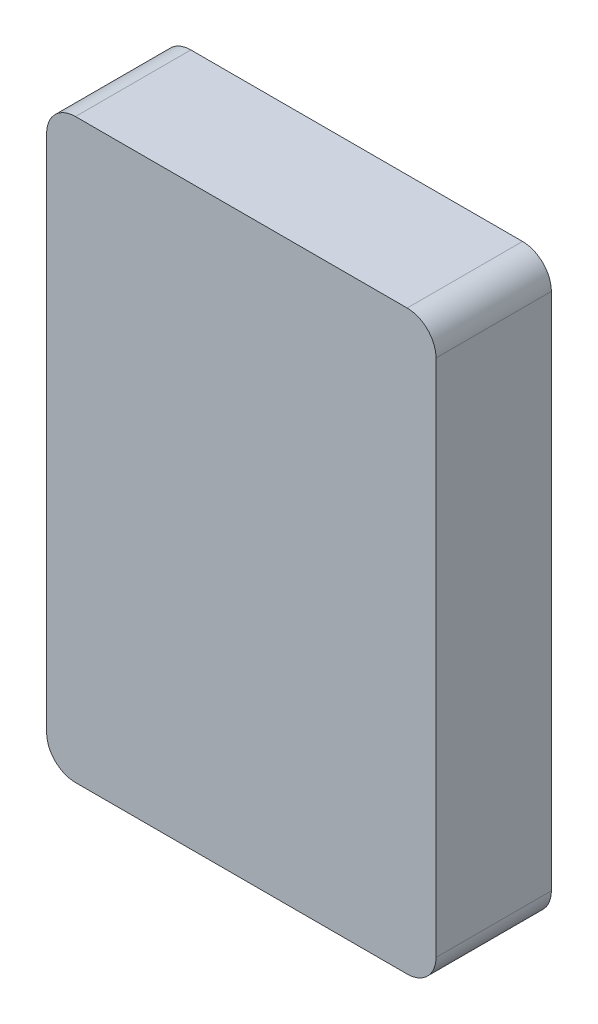
ISO-10303-21;
HEADER;
FILE_DESCRIPTION(('STEP AP214'),'2;1');
FILE_NAME('part.step','',(''),(''),'','','');
FILE_SCHEMA(('AUTOMOTIVE_DESIGN { 1 0 10303 214 1 1 1 1 }'));
ENDSEC;
DATA;
#1=APPLICATION_CONTEXT('core data for automotive mechanical design processes');
#2=APPLICATION_PROTOCOL_DEFINITION('international standard','automotive_design',2000,#1);
#3=PRODUCT_CONTEXT('',#1,'mechanical');
#4=PRODUCT('Part','Part','',(#3));
#5=PRODUCT_RELATED_PRODUCT_CATEGORY('part','',(#4));
#6=PRODUCT_DEFINITION_FORMATION('','',#4);
#7=PRODUCT_DEFINITION_CONTEXT('part definition',#1,'design');
#8=PRODUCT_DEFINITION('design','',#6,#7);
#9=PRODUCT_DEFINITION_SHAPE('','',#8);
#10=(LENGTH_UNIT() NAMED_UNIT(*) SI_UNIT(.MILLI.,.METRE.));
#11=(NAMED_UNIT(*) PLANE_ANGLE_UNIT() SI_UNIT($,.RADIAN.));
#12=(NAMED_UNIT(*) SI_UNIT($,.STERADIAN.) SOLID_ANGLE_UNIT());
#13=UNCERTAINTY_MEASURE_WITH_UNIT(LENGTH_MEASURE(1.E-05),#10,'distance_accuracy_value','');
#14=(GEOMETRIC_REPRESENTATION_CONTEXT(3) GLOBAL_UNCERTAINTY_ASSIGNED_CONTEXT((#13)) GLOBAL_UNIT_ASSIGNED_CONTEXT((#10,
#11,#12)) REPRESENTATION_CONTEXT('',''));
#15=CARTESIAN_POINT('',(0.,0.,0.));
#16=DIRECTION('',(0.,0.,1.));
#17=DIRECTION('',(1.,0.,0.));
#18=AXIS2_PLACEMENT_3D('',#15,#16,#17);
#19=CARTESIAN_POINT('',(13.5,20.,8.));
#20=DIRECTION('',(-1.,0.,0.));
#21=DIRECTION('',(0.,-1.,0.));
#22=AXIS2_PLACEMENT_3D('',#19,#20,#21);
#23=PLANE('',#22);
#24=DIRECTION('',(0.,1.,0.));
#25=VECTOR('',#24,1.);
#26=CARTESIAN_POINT('',(13.5,20.,8.));
#27=LINE('',#26,#25);
#28=CARTESIAN_POINT('',(13.5,-18.,8.));
#29=VERTEX_POINT('',#28);
#30=CARTESIAN_POINT('',(13.5,18.,8.));
#31=VERTEX_POINT('',#30);
#32=EDGE_CURVE('E124',#29,#31,#27,.T.);
#33=ORIENTED_EDGE('',*,*,#32,.F.);
#34=DIRECTION('',(0.,0.,-1.));
#35=VECTOR('',#34,1.);
#36=CARTESIAN_POINT('',(13.5,-18.,8.));
#37=LINE('',#36,#35);
#38=CARTESIAN_POINT('',(13.5,-18.,0.));
#39=VERTEX_POINT('',#38);
#40=EDGE_CURVE('E150',#29,#39,#37,.T.);
#41=ORIENTED_EDGE('',*,*,#40,.T.);
#42=DIRECTION('',(0.,1.,0.));
#43=VECTOR('',#42,1.);
#44=CARTESIAN_POINT('',(13.5,20.,0.));
#45=LINE('',#44,#43);
#46=CARTESIAN_POINT('',(13.5,18.,0.));
#47=VERTEX_POINT('',#46);
#48=EDGE_CURVE('E156',#39,#47,#45,.T.);
#49=ORIENTED_EDGE('',*,*,#48,.T.);
#50=DIRECTION('',(0.,0.,-1.));
#51=VECTOR('',#50,1.);
#52=CARTESIAN_POINT('',(13.5,18.,8.));
#53=LINE('',#52,#51);
#54=EDGE_CURVE('E148',#47,#31,#53,.F.);
#55=ORIENTED_EDGE('',*,*,#54,.T.);
#56=EDGE_LOOP('',(#33,#41,#49,#55));
#57=FACE_BOUND('',#56,.T.);
#58=ADVANCED_FACE('F32',(#57),#23,.F.);
#59=CARTESIAN_POINT('',(-13.5,20.,8.));
#60=DIRECTION('',(0.,-1.,0.));
#61=DIRECTION('',(0.,0.,-1.));
#62=AXIS2_PLACEMENT_3D('',#59,#60,#61);
#63=PLANE('',#62);
#64=DIRECTION('',(-1.,0.,0.));
#65=VECTOR('',#64,1.);
#66=CARTESIAN_POINT('',(-13.5,20.,8.));
#67=LINE('',#66,#65);
#68=CARTESIAN_POINT('',(11.5,20.,8.));
#69=VERTEX_POINT('',#68);
#70=CARTESIAN_POINT('',(-11.5,20.,8.));
#71=VERTEX_POINT('',#70);
#72=EDGE_CURVE('E127',#69,#71,#67,.T.);
#73=ORIENTED_EDGE('',*,*,#72,.F.);
#74=DIRECTION('',(0.,0.,-1.));
#75=VECTOR('',#74,1.);
#76=CARTESIAN_POINT('',(11.5,20.,8.));
#77=LINE('',#76,#75);
#78=CARTESIAN_POINT('',(11.5,20.,0.));
#79=VERTEX_POINT('',#78);
#80=EDGE_CURVE('E11',#69,#79,#77,.T.);
#81=ORIENTED_EDGE('',*,*,#80,.T.);
#82=DIRECTION('',(-1.,0.,0.));
#83=VECTOR('',#82,1.);
#84=CARTESIAN_POINT('',(-13.5,20.,0.));
#85=LINE('',#84,#83);
#86=CARTESIAN_POINT('',(-11.5,20.,0.));
#87=VERTEX_POINT('',#86);
#88=EDGE_CURVE('E129',#79,#87,#85,.T.);
#89=ORIENTED_EDGE('',*,*,#88,.T.);
#90=DIRECTION('',(0.,0.,-1.));
#91=VECTOR('',#90,1.);
#92=CARTESIAN_POINT('',(-11.5,20.,8.));
#93=LINE('',#92,#91);
#94=EDGE_CURVE('E40',#87,#71,#93,.F.);
#95=ORIENTED_EDGE('',*,*,#94,.T.);
#96=EDGE_LOOP('',(#73,#81,#89,#95));
#97=FACE_BOUND('',#96,.T.);
#98=ADVANCED_FACE('F175',(#97),#63,.F.);
#99=CARTESIAN_POINT('',(-13.5,20.,8.));
#100=DIRECTION('',(1.,0.,0.));
#101=DIRECTION('',(0.,1.,0.));
#102=AXIS2_PLACEMENT_3D('',#99,#100,#101);
#103=PLANE('',#102);
#104=DIRECTION('',(0.,-1.,0.));
#105=VECTOR('',#104,1.);
#106=CARTESIAN_POINT('',(-13.5,20.,0.));
#107=LINE('',#106,#105);
#108=CARTESIAN_POINT('',(-13.5,18.,0.));
#109=VERTEX_POINT('',#108);
#110=CARTESIAN_POINT('',(-13.5,-18.,0.));
#111=VERTEX_POINT('',#110);
#112=EDGE_CURVE('E125',#109,#111,#107,.T.);
#113=ORIENTED_EDGE('',*,*,#112,.T.);
#114=DIRECTION('',(0.,0.,-1.));
#115=VECTOR('',#114,1.);
#116=CARTESIAN_POINT('',(-13.5,-18.,8.));
#117=LINE('',#116,#115);
#118=CARTESIAN_POINT('',(-13.5,-18.,8.));
#119=VERTEX_POINT('',#118);
#120=EDGE_CURVE('E103',#111,#119,#117,.F.);
#121=ORIENTED_EDGE('',*,*,#120,.T.);
#122=DIRECTION('',(0.,-1.,0.));
#123=VECTOR('',#122,1.);
#124=CARTESIAN_POINT('',(-13.5,20.,8.));
#125=LINE('',#124,#123);
#126=CARTESIAN_POINT('',(-13.5,18.,8.));
#127=VERTEX_POINT('',#126);
#128=EDGE_CURVE('E164',#127,#119,#125,.T.);
#129=ORIENTED_EDGE('',*,*,#128,.F.);
#130=DIRECTION('',(0.,0.,-1.));
#131=VECTOR('',#130,1.);
#132=CARTESIAN_POINT('',(-13.5,18.,8.));
#133=LINE('',#132,#131);
#134=EDGE_CURVE('E108',#127,#109,#133,.T.);
#135=ORIENTED_EDGE('',*,*,#134,.T.);
#136=EDGE_LOOP('',(#113,#121,#129,#135));
#137=FACE_BOUND('',#136,.T.);
#138=ADVANCED_FACE('F174',(#137),#103,.F.);
#139=CARTESIAN_POINT('',(-13.5,-20.,8.));
#140=DIRECTION('',(0.,1.,0.));
#141=DIRECTION('',(0.,0.,1.));
#142=AXIS2_PLACEMENT_3D('',#139,#140,#141);
#143=PLANE('',#142);
#144=DIRECTION('',(1.,0.,0.));
#145=VECTOR('',#144,1.);
#146=CARTESIAN_POINT('',(-13.5,-20.,8.));
#147=LINE('',#146,#145);
#148=CARTESIAN_POINT('',(-11.5,-20.,8.));
#149=VERTEX_POINT('',#148);
#150=CARTESIAN_POINT('',(11.5,-20.,8.));
#151=VERTEX_POINT('',#150);
#152=EDGE_CURVE('E118',#149,#151,#147,.T.);
#153=ORIENTED_EDGE('',*,*,#152,.F.);
#154=DIRECTION('',(0.,0.,-1.));
#155=VECTOR('',#154,1.);
#156=CARTESIAN_POINT('',(-11.5,-20.,8.));
#157=LINE('',#156,#155);
#158=CARTESIAN_POINT('',(-11.5,-20.,0.));
#159=VERTEX_POINT('',#158);
#160=EDGE_CURVE('E102',#149,#159,#157,.T.);
#161=ORIENTED_EDGE('',*,*,#160,.T.);
#162=DIRECTION('',(1.,0.,0.));
#163=VECTOR('',#162,1.);
#164=CARTESIAN_POINT('',(-13.5,-20.,0.));
#165=LINE('',#164,#163);
#166=CARTESIAN_POINT('',(11.5,-20.,0.));
#167=VERTEX_POINT('',#166);
#168=EDGE_CURVE('E115',#159,#167,#165,.T.);
#169=ORIENTED_EDGE('',*,*,#168,.T.);
#170=DIRECTION('',(0.,0.,-1.));
#171=VECTOR('',#170,1.);
#172=CARTESIAN_POINT('',(11.5,-20.,8.));
#173=LINE('',#172,#171);
#174=EDGE_CURVE('E120',#167,#151,#173,.F.);
#175=ORIENTED_EDGE('',*,*,#174,.T.);
#176=EDGE_LOOP('',(#153,#161,#169,#175));
#177=FACE_BOUND('',#176,.T.);
#178=ADVANCED_FACE('F114',(#177),#143,.F.);
#179=CARTESIAN_POINT('',(0.,0.,8.));
#180=DIRECTION('',(0.,0.,1.));
#181=DIRECTION('',(1.,0.,0.));
#182=AXIS2_PLACEMENT_3D('',#179,#180,#181);
#183=PLANE('',#182);
#184=ORIENTED_EDGE('',*,*,#128,.T.);
#185=CARTESIAN_POINT('',(-11.5,-18.,8.));
#186=DIRECTION('',(0.,0.,1.));
#187=DIRECTION('',(1.,0.,0.));
#188=AXIS2_PLACEMENT_3D('',#185,#186,#187);
#189=CIRCLE('',#188,2.);
#190=EDGE_CURVE('E146',#119,#149,#189,.T.);
#191=ORIENTED_EDGE('',*,*,#190,.T.);
#192=ORIENTED_EDGE('',*,*,#152,.T.);
#193=CARTESIAN_POINT('',(11.5,-18.,8.));
#194=DIRECTION('',(0.,0.,1.));
#195=DIRECTION('',(1.,0.,0.));
#196=AXIS2_PLACEMENT_3D('',#193,#194,#195);
#197=CIRCLE('',#196,2.);
#198=EDGE_CURVE('E144',#151,#29,#197,.T.);
#199=ORIENTED_EDGE('',*,*,#198,.T.);
#200=ORIENTED_EDGE('',*,*,#32,.T.);
#201=CARTESIAN_POINT('',(11.5,18.,8.));
#202=DIRECTION('',(0.,0.,1.));
#203=DIRECTION('',(1.,0.,0.));
#204=AXIS2_PLACEMENT_3D('',#201,#202,#203);
#205=CIRCLE('',#204,2.);
#206=EDGE_CURVE('E53',#31,#69,#205,.T.);
#207=ORIENTED_EDGE('',*,*,#206,.T.);
#208=ORIENTED_EDGE('',*,*,#72,.T.);
#209=CARTESIAN_POINT('',(-11.5,18.,8.));
#210=DIRECTION('',(0.,0.,1.));
#211=DIRECTION('',(1.,0.,0.));
#212=AXIS2_PLACEMENT_3D('',#209,#210,#211);
#213=CIRCLE('',#212,2.);
#214=EDGE_CURVE('E141',#71,#127,#213,.T.);
#215=ORIENTED_EDGE('',*,*,#214,.T.);
#216=EDGE_LOOP('',(#184,#191,#192,#199,#200,#207,#208,#215));
#217=FACE_BOUND('',#216,.T.);
#218=ADVANCED_FACE('F168',(#217),#183,.T.);
#219=CARTESIAN_POINT('',(0.,0.,0.));
#220=DIRECTION('',(0.,0.,1.));
#221=DIRECTION('',(1.,0.,0.));
#222=AXIS2_PLACEMENT_3D('',#219,#220,#221);
#223=PLANE('',#222);
#224=ORIENTED_EDGE('',*,*,#168,.F.);
#225=CARTESIAN_POINT('',(-11.5,-18.,0.));
#226=DIRECTION('',(0.,0.,1.));
#227=DIRECTION('',(1.,0.,0.));
#228=AXIS2_PLACEMENT_3D('',#225,#226,#227);
#229=CIRCLE('',#228,2.);
#230=EDGE_CURVE('E98',#159,#111,#229,.F.);
#231=ORIENTED_EDGE('',*,*,#230,.T.);
#232=ORIENTED_EDGE('',*,*,#112,.F.);
#233=CARTESIAN_POINT('',(-11.5,18.,0.));
#234=DIRECTION('',(0.,0.,1.));
#235=DIRECTION('',(1.,0.,0.));
#236=AXIS2_PLACEMENT_3D('',#233,#234,#235);
#237=CIRCLE('',#236,2.);
#238=EDGE_CURVE('E119',#109,#87,#237,.F.);
#239=ORIENTED_EDGE('',*,*,#238,.T.);
#240=ORIENTED_EDGE('',*,*,#88,.F.);
#241=CARTESIAN_POINT('',(11.5,18.,0.));
#242=DIRECTION('',(0.,0.,1.));
#243=DIRECTION('',(1.,0.,0.));
#244=AXIS2_PLACEMENT_3D('',#241,#242,#243);
#245=CIRCLE('',#244,2.);
#246=EDGE_CURVE('E135',#79,#47,#245,.F.);
#247=ORIENTED_EDGE('',*,*,#246,.T.);
#248=ORIENTED_EDGE('',*,*,#48,.F.);
#249=CARTESIAN_POINT('',(11.5,-18.,0.));
#250=DIRECTION('',(0.,0.,1.));
#251=DIRECTION('',(1.,0.,0.));
#252=AXIS2_PLACEMENT_3D('',#249,#250,#251);
#253=CIRCLE('',#252,2.);
#254=EDGE_CURVE('E109',#39,#167,#253,.F.);
#255=ORIENTED_EDGE('',*,*,#254,.T.);
#256=EDGE_LOOP('',(#224,#231,#232,#239,#240,#247,#248,#255));
#257=FACE_BOUND('',#256,.T.);
#258=ADVANCED_FACE('F122',(#257),#223,.F.);
#259=CARTESIAN_POINT('',(-11.5,-18.,8.));
#260=DIRECTION('',(0.,0.,-1.));
#261=DIRECTION('',(-1.,0.,0.));
#262=AXIS2_PLACEMENT_3D('',#259,#260,#261);
#263=CYLINDRICAL_SURFACE('',#262,2.);
#264=ORIENTED_EDGE('',*,*,#190,.F.);
#265=ORIENTED_EDGE('',*,*,#120,.F.);
#266=ORIENTED_EDGE('',*,*,#230,.F.);
#267=ORIENTED_EDGE('',*,*,#160,.F.);
#268=EDGE_LOOP('',(#264,#265,#266,#267));
#269=FACE_BOUND('',#268,.T.);
#270=ADVANCED_FACE('F101',(#269),#263,.T.);
#271=CARTESIAN_POINT('',(11.5,-18.,8.));
#272=DIRECTION('',(0.,0.,-1.));
#273=DIRECTION('',(-1.,0.,0.));
#274=AXIS2_PLACEMENT_3D('',#271,#272,#273);
#275=CYLINDRICAL_SURFACE('',#274,2.);
#276=ORIENTED_EDGE('',*,*,#198,.F.);
#277=ORIENTED_EDGE('',*,*,#174,.F.);
#278=ORIENTED_EDGE('',*,*,#254,.F.);
#279=ORIENTED_EDGE('',*,*,#40,.F.);
#280=EDGE_LOOP('',(#276,#277,#278,#279));
#281=FACE_BOUND('',#280,.T.);
#282=ADVANCED_FACE('F178',(#281),#275,.T.);
#283=CARTESIAN_POINT('',(11.5,18.,8.));
#284=DIRECTION('',(0.,0.,-1.));
#285=DIRECTION('',(-1.,0.,0.));
#286=AXIS2_PLACEMENT_3D('',#283,#284,#285);
#287=CYLINDRICAL_SURFACE('',#286,2.);
#288=ORIENTED_EDGE('',*,*,#206,.F.);
#289=ORIENTED_EDGE('',*,*,#54,.F.);
#290=ORIENTED_EDGE('',*,*,#246,.F.);
#291=ORIENTED_EDGE('',*,*,#80,.F.);
#292=EDGE_LOOP('',(#288,#289,#290,#291));
#293=FACE_BOUND('',#292,.T.);
#294=ADVANCED_FACE('F177',(#293),#287,.T.);
#295=CARTESIAN_POINT('',(-11.5,18.,8.));
#296=DIRECTION('',(0.,0.,-1.));
#297=DIRECTION('',(-1.,0.,0.));
#298=AXIS2_PLACEMENT_3D('',#295,#296,#297);
#299=CYLINDRICAL_SURFACE('',#298,2.);
#300=ORIENTED_EDGE('',*,*,#214,.F.);
#301=ORIENTED_EDGE('',*,*,#94,.F.);
#302=ORIENTED_EDGE('',*,*,#238,.F.);
#303=ORIENTED_EDGE('',*,*,#134,.F.);
#304=EDGE_LOOP('',(#300,#301,#302,#303));
#305=FACE_BOUND('',#304,.T.);
#306=ADVANCED_FACE('F34',(#305),#299,.T.);
#307=CLOSED_SHELL('',(#58,#98,#138,#178,#218,#258,#270,#282,#294,#306));
#308=MANIFOLD_SOLID_BREP('B2',#307);
#309=ADVANCED_BREP_SHAPE_REPRESENTATION('',(#18,#308),#14);
#310=SHAPE_DEFINITION_REPRESENTATION(#9,#309);
ENDSEC;
END-ISO-10303-21;
